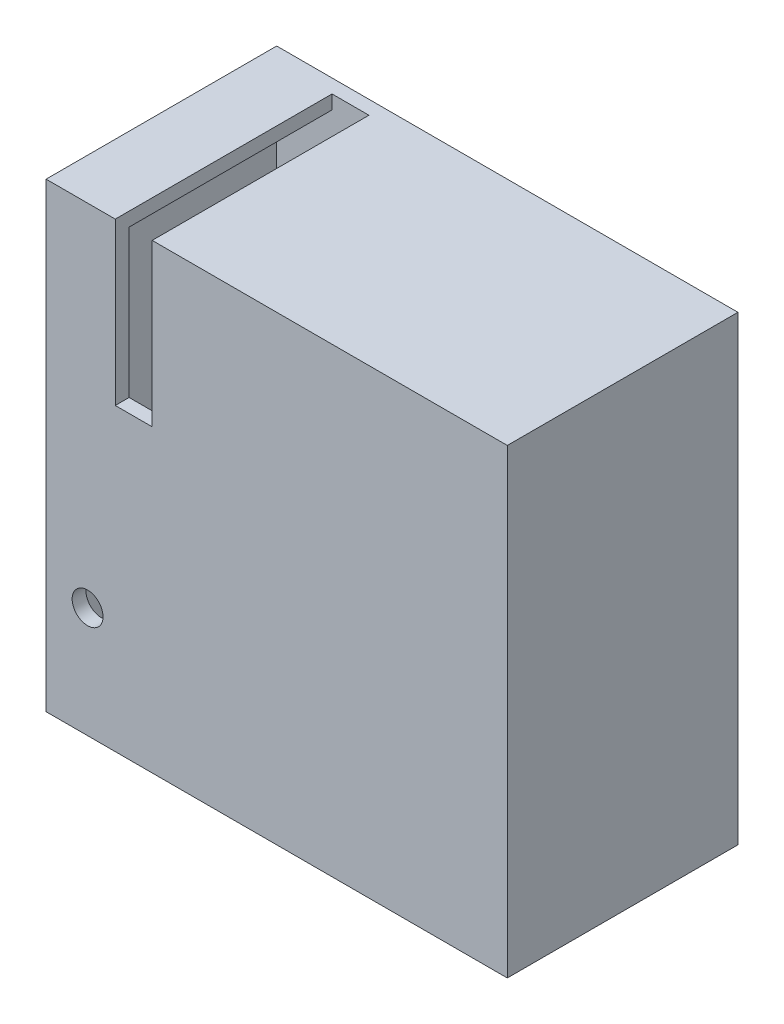
ISO-10303-21;
HEADER;
FILE_DESCRIPTION(('STEP AP214'),'2;1');
FILE_NAME('part.step','',(''),(''),'','','');
FILE_SCHEMA(('AUTOMOTIVE_DESIGN { 1 0 10303 214 1 1 1 1 }'));
ENDSEC;
DATA;
#1=APPLICATION_CONTEXT('core data for automotive mechanical design processes');
#2=APPLICATION_PROTOCOL_DEFINITION('international standard','automotive_design',2000,#1);
#3=PRODUCT_CONTEXT('',#1,'mechanical');
#4=PRODUCT('Part','Part','',(#3));
#5=PRODUCT_RELATED_PRODUCT_CATEGORY('part','',(#4));
#6=PRODUCT_DEFINITION_FORMATION('','',#4);
#7=PRODUCT_DEFINITION_CONTEXT('part definition',#1,'design');
#8=PRODUCT_DEFINITION('design','',#6,#7);
#9=PRODUCT_DEFINITION_SHAPE('','',#8);
#10=(LENGTH_UNIT() NAMED_UNIT(*) SI_UNIT(.MILLI.,.METRE.));
#11=(NAMED_UNIT(*) PLANE_ANGLE_UNIT() SI_UNIT($,.RADIAN.));
#12=(NAMED_UNIT(*) SI_UNIT($,.STERADIAN.) SOLID_ANGLE_UNIT());
#13=UNCERTAINTY_MEASURE_WITH_UNIT(LENGTH_MEASURE(1.E-05),#10,'distance_accuracy_value','');
#14=(GEOMETRIC_REPRESENTATION_CONTEXT(3) GLOBAL_UNCERTAINTY_ASSIGNED_CONTEXT((#13)) GLOBAL_UNIT_ASSIGNED_CONTEXT((#10,
#11,#12)) REPRESENTATION_CONTEXT('',''));
#15=CARTESIAN_POINT('',(0.,0.,0.));
#16=DIRECTION('',(0.,0.,1.));
#17=DIRECTION('',(1.,0.,0.));
#18=AXIS2_PLACEMENT_3D('',#15,#16,#17);
#19=CARTESIAN_POINT('',(0.,0.,-50.));
#20=DIRECTION('',(-1.,0.,0.));
#21=DIRECTION('',(0.,0.,1.));
#22=AXIS2_PLACEMENT_3D('',#19,#20,#21);
#23=PLANE('',#22);
#24=DIRECTION('',(0.,0.,1.));
#25=VECTOR('',#24,1.);
#26=CARTESIAN_POINT('',(0.,20.,-31.));
#27=LINE('',#26,#25);
#28=CARTESIAN_POINT('',(0.,20.,-31.));
#29=VERTEX_POINT('',#28);
#30=CARTESIAN_POINT('',(0.,20.,-19.));
#31=VERTEX_POINT('',#30);
#32=EDGE_CURVE('E391',#29,#31,#27,.T.);
#33=ORIENTED_EDGE('',*,*,#32,.F.);
#34=DIRECTION('',(0.,-1.,0.));
#35=VECTOR('',#34,1.);
#36=CARTESIAN_POINT('',(0.,28.,-31.));
#37=LINE('',#36,#35);
#38=CARTESIAN_POINT('',(0.,28.,-31.));
#39=VERTEX_POINT('',#38);
#40=EDGE_CURVE('E196',#39,#29,#37,.T.);
#41=ORIENTED_EDGE('',*,*,#40,.F.);
#42=DIRECTION('',(0.,0.,-1.));
#43=VECTOR('',#42,1.);
#44=CARTESIAN_POINT('',(0.,28.,-31.));
#45=LINE('',#44,#43);
#46=CARTESIAN_POINT('',(0.,28.,-19.));
#47=VERTEX_POINT('',#46);
#48=EDGE_CURVE('E62',#47,#39,#45,.T.);
#49=ORIENTED_EDGE('',*,*,#48,.F.);
#50=DIRECTION('',(0.,1.,0.));
#51=VECTOR('',#50,1.);
#52=CARTESIAN_POINT('',(0.,28.,-19.));
#53=LINE('',#52,#51);
#54=EDGE_CURVE('E387',#31,#47,#53,.T.);
#55=ORIENTED_EDGE('',*,*,#54,.F.);
#56=EDGE_LOOP('',(#33,#41,#49,#55));
#57=FACE_BOUND('',#56,.T.);
#58=DIRECTION('',(0.,-1.,0.));
#59=VECTOR('',#58,1.);
#60=CARTESIAN_POINT('',(0.,0.,0.));
#61=LINE('',#60,#59);
#62=CARTESIAN_POINT('',(0.,100.,0.));
#63=VERTEX_POINT('',#62);
#64=CARTESIAN_POINT('',(0.,0.,0.));
#65=VERTEX_POINT('',#64);
#66=EDGE_CURVE('E299',#63,#65,#61,.T.);
#67=ORIENTED_EDGE('',*,*,#66,.F.);
#68=DIRECTION('',(0.,0.,1.));
#69=VECTOR('',#68,1.);
#70=CARTESIAN_POINT('',(0.,100.,-50.));
#71=LINE('',#70,#69);
#72=CARTESIAN_POINT('',(0.,100.,-50.));
#73=VERTEX_POINT('',#72);
#74=EDGE_CURVE('E333',#73,#63,#71,.T.);
#75=ORIENTED_EDGE('',*,*,#74,.F.);
#76=DIRECTION('',(0.,-1.,0.));
#77=VECTOR('',#76,1.);
#78=CARTESIAN_POINT('',(0.,0.,-50.));
#79=LINE('',#78,#77);
#80=CARTESIAN_POINT('',(0.,0.,-50.));
#81=VERTEX_POINT('',#80);
#82=EDGE_CURVE('E300',#73,#81,#79,.T.);
#83=ORIENTED_EDGE('',*,*,#82,.T.);
#84=DIRECTION('',(0.,0.,1.));
#85=VECTOR('',#84,1.);
#86=CARTESIAN_POINT('',(0.,0.,-50.));
#87=LINE('',#86,#85);
#88=EDGE_CURVE('E317',#81,#65,#87,.T.);
#89=ORIENTED_EDGE('',*,*,#88,.T.);
#90=EDGE_LOOP('',(#67,#75,#83,#89));
#91=FACE_BOUND('',#90,.T.);
#92=ADVANCED_FACE('F47',(#57,#91),#23,.T.);
#93=CARTESIAN_POINT('',(0.,100.,-50.));
#94=DIRECTION('',(0.,1.,0.));
#95=DIRECTION('',(0.,0.,1.));
#96=AXIS2_PLACEMENT_3D('',#93,#94,#95);
#97=PLANE('',#96);
#98=DIRECTION('',(0.,0.,1.));
#99=VECTOR('',#98,1.);
#100=CARTESIAN_POINT('',(23.,100.,-85.9026461420325));
#101=LINE('',#100,#99);
#102=CARTESIAN_POINT('',(23.,100.,-47.));
#103=VERTEX_POINT('',#102);
#104=CARTESIAN_POINT('',(23.,100.,0.));
#105=VERTEX_POINT('',#104);
#106=EDGE_CURVE('E286',#103,#105,#101,.T.);
#107=ORIENTED_EDGE('',*,*,#106,.T.);
#108=DIRECTION('',(-1.,0.,0.));
#109=VECTOR('',#108,1.);
#110=CARTESIAN_POINT('',(0.,100.,0.));
#111=LINE('',#110,#109);
#112=CARTESIAN_POINT('',(100.,100.,0.));
#113=VERTEX_POINT('',#112);
#114=EDGE_CURVE('E305',#113,#105,#111,.T.);
#115=ORIENTED_EDGE('',*,*,#114,.F.);
#116=DIRECTION('',(0.,0.,1.));
#117=VECTOR('',#116,1.);
#118=CARTESIAN_POINT('',(100.,100.,-50.));
#119=LINE('',#118,#117);
#120=CARTESIAN_POINT('',(100.,100.,-50.));
#121=VERTEX_POINT('',#120);
#122=EDGE_CURVE('E337',#121,#113,#119,.T.);
#123=ORIENTED_EDGE('',*,*,#122,.F.);
#124=DIRECTION('',(-1.,0.,0.));
#125=VECTOR('',#124,1.);
#126=CARTESIAN_POINT('',(0.,100.,-50.));
#127=LINE('',#126,#125);
#128=EDGE_CURVE('E313',#121,#73,#127,.T.);
#129=ORIENTED_EDGE('',*,*,#128,.T.);
#130=ORIENTED_EDGE('',*,*,#74,.T.);
#131=CARTESIAN_POINT('',(15.,100.,0.));
#132=VERTEX_POINT('',#131);
#133=EDGE_CURVE('E329',#132,#63,#111,.T.);
#134=ORIENTED_EDGE('',*,*,#133,.F.);
#135=DIRECTION('',(0.,0.,1.));
#136=VECTOR('',#135,1.);
#137=CARTESIAN_POINT('',(15.,100.,-85.9026461420325));
#138=LINE('',#137,#136);
#139=CARTESIAN_POINT('',(15.,100.,-47.));
#140=VERTEX_POINT('',#139);
#141=EDGE_CURVE('E281',#140,#132,#138,.T.);
#142=ORIENTED_EDGE('',*,*,#141,.F.);
#143=DIRECTION('',(-1.,0.,0.));
#144=VECTOR('',#143,1.);
#145=CARTESIAN_POINT('',(15.,100.,-47.));
#146=LINE('',#145,#144);
#147=EDGE_CURVE('E282',#103,#140,#146,.T.);
#148=ORIENTED_EDGE('',*,*,#147,.F.);
#149=EDGE_LOOP('',(#107,#115,#123,#129,#130,#134,#142,#148));
#150=FACE_BOUND('',#149,.T.);
#151=ADVANCED_FACE('F423',(#150),#97,.T.);
#152=CARTESIAN_POINT('',(100.,0.,-50.));
#153=DIRECTION('',(1.,0.,0.));
#154=DIRECTION('',(0.,0.,-1.));
#155=AXIS2_PLACEMENT_3D('',#152,#153,#154);
#156=PLANE('',#155);
#157=DIRECTION('',(0.,1.,0.));
#158=VECTOR('',#157,1.);
#159=CARTESIAN_POINT('',(100.,0.,0.));
#160=LINE('',#159,#158);
#161=CARTESIAN_POINT('',(100.,0.,0.));
#162=VERTEX_POINT('',#161);
#163=EDGE_CURVE('E325',#162,#113,#160,.T.);
#164=ORIENTED_EDGE('',*,*,#163,.F.);
#165=DIRECTION('',(0.,0.,1.));
#166=VECTOR('',#165,1.);
#167=CARTESIAN_POINT('',(100.,0.,-50.));
#168=LINE('',#167,#166);
#169=CARTESIAN_POINT('',(100.,0.,-50.));
#170=VERTEX_POINT('',#169);
#171=EDGE_CURVE('E340',#170,#162,#168,.T.);
#172=ORIENTED_EDGE('',*,*,#171,.F.);
#173=DIRECTION('',(0.,1.,0.));
#174=VECTOR('',#173,1.);
#175=CARTESIAN_POINT('',(100.,0.,-50.));
#176=LINE('',#175,#174);
#177=EDGE_CURVE('E309',#170,#121,#176,.T.);
#178=ORIENTED_EDGE('',*,*,#177,.T.);
#179=ORIENTED_EDGE('',*,*,#122,.T.);
#180=EDGE_LOOP('',(#164,#172,#178,#179));
#181=FACE_BOUND('',#180,.T.);
#182=ADVANCED_FACE('F429',(#181),#156,.T.);
#183=CARTESIAN_POINT('',(0.,0.,-50.));
#184=DIRECTION('',(0.,-1.,0.));
#185=DIRECTION('',(0.,0.,-1.));
#186=AXIS2_PLACEMENT_3D('',#183,#184,#185);
#187=PLANE('',#186);
#188=DIRECTION('',(1.,0.,0.));
#189=VECTOR('',#188,1.);
#190=CARTESIAN_POINT('',(3.00000000000001,0.,-47.));
#191=LINE('',#190,#189);
#192=CARTESIAN_POINT('',(3.00000000000001,0.,-47.));
#193=VERTEX_POINT('',#192);
#194=CARTESIAN_POINT('',(97.,0.,-47.));
#195=VERTEX_POINT('',#194);
#196=EDGE_CURVE('E216',#193,#195,#191,.T.);
#197=ORIENTED_EDGE('',*,*,#196,.F.);
#198=DIRECTION('',(0.,0.,-1.));
#199=VECTOR('',#198,1.);
#200=CARTESIAN_POINT('',(3.,0.,-3.));
#201=LINE('',#200,#199);
#202=CARTESIAN_POINT('',(3.,0.,-3.));
#203=VERTEX_POINT('',#202);
#204=EDGE_CURVE('E207',#203,#193,#201,.T.);
#205=ORIENTED_EDGE('',*,*,#204,.F.);
#206=DIRECTION('',(-1.,0.,0.));
#207=VECTOR('',#206,1.);
#208=CARTESIAN_POINT('',(3.,0.,-3.));
#209=LINE('',#208,#207);
#210=CARTESIAN_POINT('',(97.,0.,-3.));
#211=VERTEX_POINT('',#210);
#212=EDGE_CURVE('E208',#211,#203,#209,.T.);
#213=ORIENTED_EDGE('',*,*,#212,.F.);
#214=DIRECTION('',(0.,0.,1.));
#215=VECTOR('',#214,1.);
#216=CARTESIAN_POINT('',(97.,0.,-3.));
#217=LINE('',#216,#215);
#218=EDGE_CURVE('E212',#195,#211,#217,.T.);
#219=ORIENTED_EDGE('',*,*,#218,.F.);
#220=EDGE_LOOP('',(#197,#205,#213,#219));
#221=FACE_BOUND('',#220,.T.);
#222=DIRECTION('',(1.,0.,0.));
#223=VECTOR('',#222,1.);
#224=CARTESIAN_POINT('',(0.,0.,0.));
#225=LINE('',#224,#223);
#226=EDGE_CURVE('E321',#65,#162,#225,.T.);
#227=ORIENTED_EDGE('',*,*,#226,.F.);
#228=ORIENTED_EDGE('',*,*,#88,.F.);
#229=DIRECTION('',(1.,0.,0.));
#230=VECTOR('',#229,1.);
#231=CARTESIAN_POINT('',(0.,0.,-50.));
#232=LINE('',#231,#230);
#233=EDGE_CURVE('E304',#81,#170,#232,.T.);
#234=ORIENTED_EDGE('',*,*,#233,.T.);
#235=ORIENTED_EDGE('',*,*,#171,.T.);
#236=EDGE_LOOP('',(#227,#228,#234,#235));
#237=FACE_BOUND('',#236,.T.);
#238=ADVANCED_FACE('F378',(#221,#237),#187,.T.);
#239=CARTESIAN_POINT('',(0.,0.,-50.));
#240=DIRECTION('',(0.,0.,-1.));
#241=DIRECTION('',(-1.,0.,0.));
#242=AXIS2_PLACEMENT_3D('',#239,#240,#241);
#243=PLANE('',#242);
#244=ORIENTED_EDGE('',*,*,#82,.F.);
#245=ORIENTED_EDGE('',*,*,#128,.F.);
#246=ORIENTED_EDGE('',*,*,#177,.F.);
#247=ORIENTED_EDGE('',*,*,#233,.F.);
#248=EDGE_LOOP('',(#244,#245,#246,#247));
#249=FACE_BOUND('',#248,.T.);
#250=ADVANCED_FACE('F447',(#249),#243,.T.);
#251=CARTESIAN_POINT('',(0.,0.,0.));
#252=DIRECTION('',(0.,0.,-1.));
#253=DIRECTION('',(-1.,0.,0.));
#254=AXIS2_PLACEMENT_3D('',#251,#252,#253);
#255=PLANE('',#254);
#256=CARTESIAN_POINT('',(8.99999999999998,24.,0.));
#257=DIRECTION('',(0.,0.,1.));
#258=DIRECTION('',(1.,0.,0.));
#259=AXIS2_PLACEMENT_3D('',#256,#257,#258);
#260=CIRCLE('',#259,3.35);
#261=CARTESIAN_POINT('',(12.35,24.,0.));
#262=VERTEX_POINT('',#261);
#263=EDGE_CURVE('E400',#262,#262,#260,.T.);
#264=ORIENTED_EDGE('',*,*,#263,.F.);
#265=EDGE_LOOP('',(#264));
#266=FACE_BOUND('',#265,.T.);
#267=ORIENTED_EDGE('',*,*,#114,.T.);
#268=DIRECTION('',(0.,1.,0.));
#269=VECTOR('',#268,1.);
#270=CARTESIAN_POINT('',(23.,100.,0.));
#271=LINE('',#270,#269);
#272=CARTESIAN_POINT('',(23.,65.,0.));
#273=VERTEX_POINT('',#272);
#274=EDGE_CURVE('E265',#273,#105,#271,.T.);
#275=ORIENTED_EDGE('',*,*,#274,.F.);
#276=DIRECTION('',(1.,0.,0.));
#277=VECTOR('',#276,1.);
#278=CARTESIAN_POINT('',(15.,65.,0.));
#279=LINE('',#278,#277);
#280=CARTESIAN_POINT('',(15.,65.,0.));
#281=VERTEX_POINT('',#280);
#282=EDGE_CURVE('E269',#281,#273,#279,.T.);
#283=ORIENTED_EDGE('',*,*,#282,.F.);
#284=DIRECTION('',(0.,-1.,0.));
#285=VECTOR('',#284,1.);
#286=CARTESIAN_POINT('',(15.,100.,0.));
#287=LINE('',#286,#285);
#288=EDGE_CURVE('E264',#132,#281,#287,.T.);
#289=ORIENTED_EDGE('',*,*,#288,.F.);
#290=ORIENTED_EDGE('',*,*,#133,.T.);
#291=ORIENTED_EDGE('',*,*,#66,.T.);
#292=ORIENTED_EDGE('',*,*,#226,.T.);
#293=ORIENTED_EDGE('',*,*,#163,.T.);
#294=EDGE_LOOP('',(#267,#275,#283,#289,#290,#291,#292,#293));
#295=FACE_BOUND('',#294,.T.);
#296=ADVANCED_FACE('F438',(#266,#295),#255,.F.);
#297=CARTESIAN_POINT('',(0.,0.,-47.));
#298=DIRECTION('',(0.,0.,-1.));
#299=DIRECTION('',(-1.,0.,0.));
#300=AXIS2_PLACEMENT_3D('',#297,#298,#299);
#301=PLANE('',#300);
#302=DIRECTION('',(0.,-1.,0.));
#303=VECTOR('',#302,1.);
#304=CARTESIAN_POINT('',(15.,100.,-47.));
#305=LINE('',#304,#303);
#306=CARTESIAN_POINT('',(15.,97.,-47.));
#307=VERTEX_POINT('',#306);
#308=EDGE_CURVE('E276',#140,#307,#305,.T.);
#309=ORIENTED_EDGE('',*,*,#308,.T.);
#310=DIRECTION('',(1.,0.,0.));
#311=VECTOR('',#310,1.);
#312=CARTESIAN_POINT('',(3.00000000000001,97.,-47.));
#313=LINE('',#312,#311);
#314=CARTESIAN_POINT('',(3.00000000000001,97.,-47.));
#315=VERTEX_POINT('',#314);
#316=EDGE_CURVE('E223',#315,#307,#313,.T.);
#317=ORIENTED_EDGE('',*,*,#316,.F.);
#318=DIRECTION('',(0.,-1.,0.));
#319=VECTOR('',#318,1.);
#320=CARTESIAN_POINT('',(3.00000000000001,203.788245962633,-47.));
#321=LINE('',#320,#319);
#322=EDGE_CURVE('E231',#315,#193,#321,.T.);
#323=ORIENTED_EDGE('',*,*,#322,.T.);
#324=ORIENTED_EDGE('',*,*,#196,.T.);
#325=DIRECTION('',(0.,-1.,0.));
#326=VECTOR('',#325,1.);
#327=CARTESIAN_POINT('',(97.,203.788245962633,-47.));
#328=LINE('',#327,#326);
#329=CARTESIAN_POINT('',(97.,97.,-47.));
#330=VERTEX_POINT('',#329);
#331=EDGE_CURVE('E226',#330,#195,#328,.T.);
#332=ORIENTED_EDGE('',*,*,#331,.F.);
#333=CARTESIAN_POINT('',(23.,97.,-47.));
#334=VERTEX_POINT('',#333);
#335=EDGE_CURVE('E211',#334,#330,#313,.T.);
#336=ORIENTED_EDGE('',*,*,#335,.F.);
#337=DIRECTION('',(0.,1.,0.));
#338=VECTOR('',#337,1.);
#339=CARTESIAN_POINT('',(23.,100.,-47.));
#340=LINE('',#339,#338);
#341=EDGE_CURVE('E287',#334,#103,#340,.T.);
#342=ORIENTED_EDGE('',*,*,#341,.T.);
#343=ORIENTED_EDGE('',*,*,#147,.T.);
#344=EDGE_LOOP('',(#309,#317,#323,#324,#332,#336,#342,#343));
#345=FACE_BOUND('',#344,.T.);
#346=ADVANCED_FACE('F371',(#345),#301,.F.);
#347=CARTESIAN_POINT('',(15.,65.,-85.9026461420325));
#348=DIRECTION('',(0.,-1.,0.));
#349=DIRECTION('',(0.,0.,-1.));
#350=AXIS2_PLACEMENT_3D('',#347,#348,#349);
#351=PLANE('',#350);
#352=DIRECTION('',(0.,0.,1.));
#353=VECTOR('',#352,1.);
#354=CARTESIAN_POINT('',(23.,65.,-85.9026461420325));
#355=LINE('',#354,#353);
#356=CARTESIAN_POINT('',(23.,65.,-3.));
#357=VERTEX_POINT('',#356);
#358=EDGE_CURVE('E268',#357,#273,#355,.T.);
#359=ORIENTED_EDGE('',*,*,#358,.F.);
#360=DIRECTION('',(-1.,0.,0.));
#361=VECTOR('',#360,1.);
#362=CARTESIAN_POINT('',(15.,65.,-3.));
#363=LINE('',#362,#361);
#364=CARTESIAN_POINT('',(15.,65.,-3.));
#365=VERTEX_POINT('',#364);
#366=EDGE_CURVE('E252',#357,#365,#363,.T.);
#367=ORIENTED_EDGE('',*,*,#366,.T.);
#368=DIRECTION('',(0.,0.,1.));
#369=VECTOR('',#368,1.);
#370=CARTESIAN_POINT('',(15.,65.,-85.9026461420325));
#371=LINE('',#370,#369);
#372=EDGE_CURVE('E280',#365,#281,#371,.T.);
#373=ORIENTED_EDGE('',*,*,#372,.T.);
#374=ORIENTED_EDGE('',*,*,#282,.T.);
#375=EDGE_LOOP('',(#359,#367,#373,#374));
#376=FACE_BOUND('',#375,.T.);
#377=ADVANCED_FACE('F355',(#376),#351,.F.);
#378=CARTESIAN_POINT('',(23.,100.,-85.9026461420325));
#379=DIRECTION('',(1.,0.,0.));
#380=DIRECTION('',(0.,1.,0.));
#381=AXIS2_PLACEMENT_3D('',#378,#379,#380);
#382=PLANE('',#381);
#383=ORIENTED_EDGE('',*,*,#341,.F.);
#384=DIRECTION('',(0.,0.,1.));
#385=VECTOR('',#384,1.);
#386=CARTESIAN_POINT('',(23.,97.,-85.9026461420325));
#387=LINE('',#386,#385);
#388=CARTESIAN_POINT('',(23.,97.,-3.));
#389=VERTEX_POINT('',#388);
#390=EDGE_CURVE('E260',#334,#389,#387,.T.);
#391=ORIENTED_EDGE('',*,*,#390,.T.);
#392=DIRECTION('',(0.,-1.,0.));
#393=VECTOR('',#392,1.);
#394=CARTESIAN_POINT('',(23.,100.,-3.));
#395=LINE('',#394,#393);
#396=EDGE_CURVE('E256',#389,#357,#395,.T.);
#397=ORIENTED_EDGE('',*,*,#396,.T.);
#398=ORIENTED_EDGE('',*,*,#358,.T.);
#399=ORIENTED_EDGE('',*,*,#274,.T.);
#400=ORIENTED_EDGE('',*,*,#106,.F.);
#401=EDGE_LOOP('',(#383,#391,#397,#398,#399,#400));
#402=FACE_BOUND('',#401,.T.);
#403=ADVANCED_FACE('F360',(#402),#382,.F.);
#404=CARTESIAN_POINT('',(15.,100.,-85.9026461420325));
#405=DIRECTION('',(-1.,0.,0.));
#406=DIRECTION('',(0.,-1.,0.));
#407=AXIS2_PLACEMENT_3D('',#404,#405,#406);
#408=PLANE('',#407);
#409=DIRECTION('',(0.,1.,0.));
#410=VECTOR('',#409,1.);
#411=CARTESIAN_POINT('',(15.,100.,-3.));
#412=LINE('',#411,#410);
#413=CARTESIAN_POINT('',(15.,97.,-3.));
#414=VERTEX_POINT('',#413);
#415=EDGE_CURVE('E55',#365,#414,#412,.T.);
#416=ORIENTED_EDGE('',*,*,#415,.T.);
#417=DIRECTION('',(0.,0.,-1.));
#418=VECTOR('',#417,1.);
#419=CARTESIAN_POINT('',(15.,97.,-85.9026461420325));
#420=LINE('',#419,#418);
#421=EDGE_CURVE('E12',#414,#307,#420,.T.);
#422=ORIENTED_EDGE('',*,*,#421,.T.);
#423=ORIENTED_EDGE('',*,*,#308,.F.);
#424=ORIENTED_EDGE('',*,*,#141,.T.);
#425=ORIENTED_EDGE('',*,*,#288,.T.);
#426=ORIENTED_EDGE('',*,*,#372,.F.);
#427=EDGE_LOOP('',(#416,#422,#423,#424,#425,#426));
#428=FACE_BOUND('',#427,.T.);
#429=ADVANCED_FACE('F348',(#428),#408,.F.);
#430=CARTESIAN_POINT('',(0.,97.,-50.));
#431=DIRECTION('',(0.,1.,0.));
#432=DIRECTION('',(0.,0.,1.));
#433=AXIS2_PLACEMENT_3D('',#430,#431,#432);
#434=PLANE('',#433);
#435=ORIENTED_EDGE('',*,*,#335,.T.);
#436=DIRECTION('',(0.,0.,1.));
#437=VECTOR('',#436,1.);
#438=CARTESIAN_POINT('',(97.,97.,-3.));
#439=LINE('',#438,#437);
#440=CARTESIAN_POINT('',(97.,97.,-3.));
#441=VERTEX_POINT('',#440);
#442=EDGE_CURVE('E238',#330,#441,#439,.T.);
#443=ORIENTED_EDGE('',*,*,#442,.T.);
#444=DIRECTION('',(-1.,0.,0.));
#445=VECTOR('',#444,1.);
#446=CARTESIAN_POINT('',(3.,97.,-3.));
#447=LINE('',#446,#445);
#448=EDGE_CURVE('E233',#441,#389,#447,.T.);
#449=ORIENTED_EDGE('',*,*,#448,.T.);
#450=ORIENTED_EDGE('',*,*,#390,.F.);
#451=EDGE_LOOP('',(#435,#443,#449,#450));
#452=FACE_BOUND('',#451,.T.);
#453=ADVANCED_FACE('F364',(#452),#434,.F.);
#454=CARTESIAN_POINT('',(3.,97.,-3.));
#455=VERTEX_POINT('',#454);
#456=EDGE_CURVE('E237',#414,#455,#447,.T.);
#457=ORIENTED_EDGE('',*,*,#456,.T.);
#458=DIRECTION('',(0.,0.,-1.));
#459=VECTOR('',#458,1.);
#460=CARTESIAN_POINT('',(3.,97.,-3.));
#461=LINE('',#460,#459);
#462=EDGE_CURVE('E227',#455,#315,#461,.T.);
#463=ORIENTED_EDGE('',*,*,#462,.T.);
#464=ORIENTED_EDGE('',*,*,#316,.T.);
#465=ORIENTED_EDGE('',*,*,#421,.F.);
#466=EDGE_LOOP('',(#457,#463,#464,#465));
#467=FACE_BOUND('',#466,.T.);
#468=ADVANCED_FACE('F382',(#467),#434,.F.);
#469=CARTESIAN_POINT('',(3.,203.788245962633,-3.));
#470=DIRECTION('',(0.,0.,1.));
#471=DIRECTION('',(1.,0.,0.));
#472=AXIS2_PLACEMENT_3D('',#469,#470,#471);
#473=PLANE('',#472);
#474=CARTESIAN_POINT('',(8.99999999999998,24.,-3.));
#475=DIRECTION('',(0.,0.,1.));
#476=DIRECTION('',(1.,0.,0.));
#477=AXIS2_PLACEMENT_3D('',#474,#475,#476);
#478=CIRCLE('',#477,3.35);
#479=CARTESIAN_POINT('',(12.35,24.,-3.));
#480=VERTEX_POINT('',#479);
#481=EDGE_CURVE('E404',#480,#480,#478,.F.);
#482=ORIENTED_EDGE('',*,*,#481,.F.);
#483=EDGE_LOOP('',(#482));
#484=FACE_BOUND('',#483,.T.);
#485=ORIENTED_EDGE('',*,*,#448,.F.);
#486=DIRECTION('',(0.,-1.,0.));
#487=VECTOR('',#486,1.);
#488=CARTESIAN_POINT('',(97.,203.788245962633,-3.));
#489=LINE('',#488,#487);
#490=EDGE_CURVE('E242',#441,#211,#489,.T.);
#491=ORIENTED_EDGE('',*,*,#490,.T.);
#492=ORIENTED_EDGE('',*,*,#212,.T.);
#493=DIRECTION('',(0.,-1.,0.));
#494=VECTOR('',#493,1.);
#495=CARTESIAN_POINT('',(3.,203.788245962633,-3.));
#496=LINE('',#495,#494);
#497=EDGE_CURVE('E232',#455,#203,#496,.T.);
#498=ORIENTED_EDGE('',*,*,#497,.F.);
#499=ORIENTED_EDGE('',*,*,#456,.F.);
#500=ORIENTED_EDGE('',*,*,#415,.F.);
#501=ORIENTED_EDGE('',*,*,#366,.F.);
#502=ORIENTED_EDGE('',*,*,#396,.F.);
#503=EDGE_LOOP('',(#485,#491,#492,#498,#499,#500,#501,#502));
#504=FACE_BOUND('',#503,.T.);
#505=ADVANCED_FACE('F351',(#484,#504),#473,.F.);
#506=CARTESIAN_POINT('',(97.,203.788245962633,-3.));
#507=DIRECTION('',(1.,0.,0.));
#508=DIRECTION('',(0.,0.,-1.));
#509=AXIS2_PLACEMENT_3D('',#506,#507,#508);
#510=PLANE('',#509);
#511=ORIENTED_EDGE('',*,*,#331,.T.);
#512=ORIENTED_EDGE('',*,*,#218,.T.);
#513=ORIENTED_EDGE('',*,*,#490,.F.);
#514=ORIENTED_EDGE('',*,*,#442,.F.);
#515=EDGE_LOOP('',(#511,#512,#513,#514));
#516=FACE_BOUND('',#515,.T.);
#517=ADVANCED_FACE('F369',(#516),#510,.F.);
#518=CARTESIAN_POINT('',(3.,203.788245962633,-3.));
#519=DIRECTION('',(-1.,0.,0.));
#520=DIRECTION('',(0.,0.,1.));
#521=AXIS2_PLACEMENT_3D('',#518,#519,#520);
#522=PLANE('',#521);
#523=DIRECTION('',(0.,1.,0.));
#524=VECTOR('',#523,1.);
#525=CARTESIAN_POINT('',(3.,28.,-31.));
#526=LINE('',#525,#524);
#527=CARTESIAN_POINT('',(3.,20.,-31.));
#528=VERTEX_POINT('',#527);
#529=CARTESIAN_POINT('',(3.,28.,-31.));
#530=VERTEX_POINT('',#529);
#531=EDGE_CURVE('E184',#528,#530,#526,.T.);
#532=ORIENTED_EDGE('',*,*,#531,.F.);
#533=DIRECTION('',(0.,0.,-1.));
#534=VECTOR('',#533,1.);
#535=CARTESIAN_POINT('',(3.,20.,-31.));
#536=LINE('',#535,#534);
#537=CARTESIAN_POINT('',(3.,20.,-19.));
#538=VERTEX_POINT('',#537);
#539=EDGE_CURVE('E70',#538,#528,#536,.T.);
#540=ORIENTED_EDGE('',*,*,#539,.F.);
#541=DIRECTION('',(0.,-1.,0.));
#542=VECTOR('',#541,1.);
#543=CARTESIAN_POINT('',(3.,28.,-19.));
#544=LINE('',#543,#542);
#545=CARTESIAN_POINT('',(3.,28.,-19.));
#546=VERTEX_POINT('',#545);
#547=EDGE_CURVE('E192',#546,#538,#544,.T.);
#548=ORIENTED_EDGE('',*,*,#547,.F.);
#549=DIRECTION('',(0.,0.,1.));
#550=VECTOR('',#549,1.);
#551=CARTESIAN_POINT('',(3.,28.,-31.));
#552=LINE('',#551,#550);
#553=EDGE_CURVE('E174',#530,#546,#552,.T.);
#554=ORIENTED_EDGE('',*,*,#553,.F.);
#555=EDGE_LOOP('',(#532,#540,#548,#554));
#556=FACE_BOUND('',#555,.T.);
#557=ORIENTED_EDGE('',*,*,#497,.T.);
#558=ORIENTED_EDGE('',*,*,#204,.T.);
#559=ORIENTED_EDGE('',*,*,#322,.F.);
#560=ORIENTED_EDGE('',*,*,#462,.F.);
#561=EDGE_LOOP('',(#557,#558,#559,#560));
#562=FACE_BOUND('',#561,.T.);
#563=ADVANCED_FACE('F189',(#556,#562),#522,.F.);
#564=CARTESIAN_POINT('',(100.001,20.,-31.));
#565=DIRECTION('',(0.,-1.,0.));
#566=DIRECTION('',(0.,0.,-1.));
#567=AXIS2_PLACEMENT_3D('',#564,#565,#566);
#568=PLANE('',#567);
#569=ORIENTED_EDGE('',*,*,#539,.T.);
#570=DIRECTION('',(-1.,0.,0.));
#571=VECTOR('',#570,1.);
#572=CARTESIAN_POINT('',(100.001,20.,-31.));
#573=LINE('',#572,#571);
#574=EDGE_CURVE('E180',#528,#29,#573,.T.);
#575=ORIENTED_EDGE('',*,*,#574,.T.);
#576=ORIENTED_EDGE('',*,*,#32,.T.);
#577=DIRECTION('',(-1.,0.,0.));
#578=VECTOR('',#577,1.);
#579=CARTESIAN_POINT('',(100.001,20.,-19.));
#580=LINE('',#579,#578);
#581=EDGE_CURVE('E202',#538,#31,#580,.T.);
#582=ORIENTED_EDGE('',*,*,#581,.F.);
#583=EDGE_LOOP('',(#569,#575,#576,#582));
#584=FACE_BOUND('',#583,.T.);
#585=ADVANCED_FACE('F497',(#584),#568,.F.);
#586=CARTESIAN_POINT('',(100.001,28.,-19.));
#587=DIRECTION('',(0.,0.,1.));
#588=DIRECTION('',(1.,0.,0.));
#589=AXIS2_PLACEMENT_3D('',#586,#587,#588);
#590=PLANE('',#589);
#591=ORIENTED_EDGE('',*,*,#547,.T.);
#592=ORIENTED_EDGE('',*,*,#581,.T.);
#593=ORIENTED_EDGE('',*,*,#54,.T.);
#594=DIRECTION('',(-1.,0.,0.));
#595=VECTOR('',#594,1.);
#596=CARTESIAN_POINT('',(100.001,28.,-19.));
#597=LINE('',#596,#595);
#598=EDGE_CURVE('E181',#546,#47,#597,.T.);
#599=ORIENTED_EDGE('',*,*,#598,.F.);
#600=EDGE_LOOP('',(#591,#592,#593,#599));
#601=FACE_BOUND('',#600,.T.);
#602=ADVANCED_FACE('F505',(#601),#590,.F.);
#603=CARTESIAN_POINT('',(100.001,28.,-31.));
#604=DIRECTION('',(0.,1.,0.));
#605=DIRECTION('',(0.,0.,1.));
#606=AXIS2_PLACEMENT_3D('',#603,#604,#605);
#607=PLANE('',#606);
#608=ORIENTED_EDGE('',*,*,#553,.T.);
#609=ORIENTED_EDGE('',*,*,#598,.T.);
#610=ORIENTED_EDGE('',*,*,#48,.T.);
#611=DIRECTION('',(-1.,0.,0.));
#612=VECTOR('',#611,1.);
#613=CARTESIAN_POINT('',(100.001,28.,-31.));
#614=LINE('',#613,#612);
#615=EDGE_CURVE('E170',#530,#39,#614,.T.);
#616=ORIENTED_EDGE('',*,*,#615,.F.);
#617=EDGE_LOOP('',(#608,#609,#610,#616));
#618=FACE_BOUND('',#617,.T.);
#619=ADVANCED_FACE('F172',(#618),#607,.F.);
#620=CARTESIAN_POINT('',(100.001,28.,-31.));
#621=DIRECTION('',(0.,0.,-1.));
#622=DIRECTION('',(-1.,0.,0.));
#623=AXIS2_PLACEMENT_3D('',#620,#621,#622);
#624=PLANE('',#623);
#625=ORIENTED_EDGE('',*,*,#531,.T.);
#626=ORIENTED_EDGE('',*,*,#615,.T.);
#627=ORIENTED_EDGE('',*,*,#40,.T.);
#628=ORIENTED_EDGE('',*,*,#574,.F.);
#629=EDGE_LOOP('',(#625,#626,#627,#628));
#630=FACE_BOUND('',#629,.T.);
#631=ADVANCED_FACE('F185',(#630),#624,.F.);
#632=CARTESIAN_POINT('',(8.99999999999998,24.,-50.001));
#633=DIRECTION('',(0.,0.,1.));
#634=DIRECTION('',(1.,0.,0.));
#635=AXIS2_PLACEMENT_3D('',#632,#633,#634);
#636=CYLINDRICAL_SURFACE('',#635,3.35);
#637=ORIENTED_EDGE('',*,*,#263,.T.);
#638=EDGE_LOOP('',(#637));
#639=FACE_BOUND('',#638,.T.);
#640=ORIENTED_EDGE('',*,*,#481,.T.);
#641=EDGE_LOOP('',(#640));
#642=FACE_BOUND('',#641,.T.);
#643=ADVANCED_FACE('F409',(#639,#642),#636,.F.);
#644=CLOSED_SHELL('',(#92,#151,#182,#238,#250,#296,#346,#377,#403,#429,#453,#468,#505,#517,#563,
#585,#602,#619,#631,#643));
#645=MANIFOLD_SOLID_BREP('B2',#644);
#646=ADVANCED_BREP_SHAPE_REPRESENTATION('',(#18,#645),#14);
#647=SHAPE_DEFINITION_REPRESENTATION(#9,#646);
ENDSEC;
END-ISO-10303-21;
